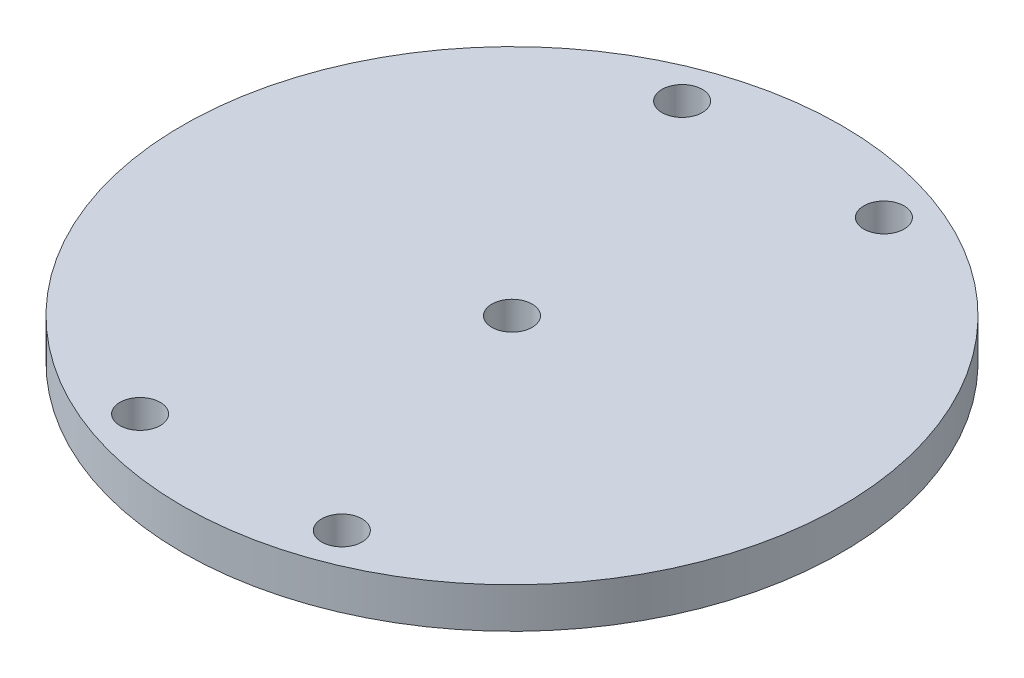
ISO-10303-21;
HEADER;
FILE_DESCRIPTION(('STEP AP214'),'2;1');
FILE_NAME('part.step','',(''),(''),'','','');
FILE_SCHEMA(('AUTOMOTIVE_DESIGN { 1 0 10303 214 1 1 1 1 }'));
ENDSEC;
DATA;
#1=APPLICATION_CONTEXT('core data for automotive mechanical design processes');
#2=APPLICATION_PROTOCOL_DEFINITION('international standard','automotive_design',2000,#1);
#3=PRODUCT_CONTEXT('',#1,'mechanical');
#4=PRODUCT('Part','Part','',(#3));
#5=PRODUCT_RELATED_PRODUCT_CATEGORY('part','',(#4));
#6=PRODUCT_DEFINITION_FORMATION('','',#4);
#7=PRODUCT_DEFINITION_CONTEXT('part definition',#1,'design');
#8=PRODUCT_DEFINITION('design','',#6,#7);
#9=PRODUCT_DEFINITION_SHAPE('','',#8);
#10=(LENGTH_UNIT() NAMED_UNIT(*) SI_UNIT(.MILLI.,.METRE.));
#11=(NAMED_UNIT(*) PLANE_ANGLE_UNIT() SI_UNIT($,.RADIAN.));
#12=(NAMED_UNIT(*) SI_UNIT($,.STERADIAN.) SOLID_ANGLE_UNIT());
#13=UNCERTAINTY_MEASURE_WITH_UNIT(LENGTH_MEASURE(1.E-05),#10,'distance_accuracy_value','');
#14=(GEOMETRIC_REPRESENTATION_CONTEXT(3) GLOBAL_UNCERTAINTY_ASSIGNED_CONTEXT((#13)) GLOBAL_UNIT_ASSIGNED_CONTEXT((#10,
#11,#12)) REPRESENTATION_CONTEXT('',''));
#15=CARTESIAN_POINT('',(0.,0.,0.));
#16=DIRECTION('',(0.,0.,1.));
#17=DIRECTION('',(1.,0.,0.));
#18=AXIS2_PLACEMENT_3D('',#15,#16,#17);
#19=CARTESIAN_POINT('',(0.,6.,0.));
#20=DIRECTION('',(0.,-1.,0.));
#21=DIRECTION('',(0.,0.,-1.));
#22=AXIS2_PLACEMENT_3D('',#19,#20,#21);
#23=CYLINDRICAL_SURFACE('',#22,49.);
#24=CARTESIAN_POINT('',(0.,6.,0.));
#25=DIRECTION('',(0.,1.,0.));
#26=DIRECTION('',(0.,0.,1.));
#27=AXIS2_PLACEMENT_3D('',#24,#25,#26);
#28=CIRCLE('',#27,49.);
#29=CARTESIAN_POINT('',(0.,6.,49.));
#30=VERTEX_POINT('',#29);
#31=EDGE_CURVE('E10',#30,#30,#28,.T.);
#32=ORIENTED_EDGE('',*,*,#31,.F.);
#33=EDGE_LOOP('',(#32));
#34=FACE_BOUND('',#33,.T.);
#35=CARTESIAN_POINT('',(0.,0.,0.));
#36=DIRECTION('',(0.,1.,0.));
#37=DIRECTION('',(0.,0.,1.));
#38=AXIS2_PLACEMENT_3D('',#35,#36,#37);
#39=CIRCLE('',#38,49.);
#40=CARTESIAN_POINT('',(0.,0.,49.));
#41=VERTEX_POINT('',#40);
#42=EDGE_CURVE('E37',#41,#41,#39,.T.);
#43=ORIENTED_EDGE('',*,*,#42,.T.);
#44=EDGE_LOOP('',(#43));
#45=FACE_BOUND('',#44,.T.);
#46=ADVANCED_FACE('F34',(#34,#45),#23,.T.);
#47=CARTESIAN_POINT('',(0.,6.,0.));
#48=DIRECTION('',(0.,1.,0.));
#49=DIRECTION('',(0.,0.,1.));
#50=AXIS2_PLACEMENT_3D('',#47,#48,#49);
#51=PLANE('',#50);
#52=CARTESIAN_POINT('',(-15.,6.,40.2988833592198));
#53=DIRECTION('',(0.,1.,0.));
#54=DIRECTION('',(0.,0.,1.));
#55=AXIS2_PLACEMENT_3D('',#52,#53,#54);
#56=CIRCLE('',#55,3.);
#57=CARTESIAN_POINT('',(-15.,6.,43.2988833592198));
#58=VERTEX_POINT('',#57);
#59=EDGE_CURVE('E70',#58,#58,#56,.T.);
#60=ORIENTED_EDGE('',*,*,#59,.F.);
#61=EDGE_LOOP('',(#60));
#62=FACE_BOUND('',#61,.T.);
#63=CARTESIAN_POINT('',(15.,6.,40.2988833592198));
#64=DIRECTION('',(0.,1.,0.));
#65=DIRECTION('',(0.,0.,1.));
#66=AXIS2_PLACEMENT_3D('',#63,#64,#65);
#67=CIRCLE('',#66,3.);
#68=CARTESIAN_POINT('',(15.,6.,43.2988833592198));
#69=VERTEX_POINT('',#68);
#70=EDGE_CURVE('E64',#69,#69,#67,.T.);
#71=ORIENTED_EDGE('',*,*,#70,.F.);
#72=EDGE_LOOP('',(#71));
#73=FACE_BOUND('',#72,.T.);
#74=CARTESIAN_POINT('',(0.,6.,0.));
#75=DIRECTION('',(0.,1.,0.));
#76=DIRECTION('',(0.,0.,1.));
#77=AXIS2_PLACEMENT_3D('',#74,#75,#76);
#78=CIRCLE('',#77,3.);
#79=CARTESIAN_POINT('',(0.,6.,3.));
#80=VERTEX_POINT('',#79);
#81=EDGE_CURVE('E58',#80,#80,#78,.T.);
#82=ORIENTED_EDGE('',*,*,#81,.F.);
#83=EDGE_LOOP('',(#82));
#84=FACE_BOUND('',#83,.T.);
#85=CARTESIAN_POINT('',(15.,6.,-40.2988833592198));
#86=DIRECTION('',(0.,1.,0.));
#87=DIRECTION('',(0.,0.,1.));
#88=AXIS2_PLACEMENT_3D('',#85,#86,#87);
#89=CIRCLE('',#88,3.);
#90=CARTESIAN_POINT('',(15.,6.,-37.2988833592198));
#91=VERTEX_POINT('',#90);
#92=EDGE_CURVE('E52',#91,#91,#89,.T.);
#93=ORIENTED_EDGE('',*,*,#92,.F.);
#94=EDGE_LOOP('',(#93));
#95=FACE_BOUND('',#94,.T.);
#96=CARTESIAN_POINT('',(-15.,6.,-40.2988833592198));
#97=DIRECTION('',(0.,1.,0.));
#98=DIRECTION('',(0.,0.,1.));
#99=AXIS2_PLACEMENT_3D('',#96,#97,#98);
#100=CIRCLE('',#99,3.);
#101=CARTESIAN_POINT('',(-15.,6.,-37.2988833592198));
#102=VERTEX_POINT('',#101);
#103=EDGE_CURVE('E46',#102,#102,#100,.T.);
#104=ORIENTED_EDGE('',*,*,#103,.F.);
#105=EDGE_LOOP('',(#104));
#106=FACE_BOUND('',#105,.T.);
#107=ORIENTED_EDGE('',*,*,#31,.T.);
#108=EDGE_LOOP('',(#107));
#109=FACE_BOUND('',#108,.T.);
#110=ADVANCED_FACE('F86',(#62,#73,#84,#95,#106,#109),#51,.T.);
#111=CARTESIAN_POINT('',(0.,0.,0.));
#112=DIRECTION('',(0.,1.,0.));
#113=DIRECTION('',(0.,0.,1.));
#114=AXIS2_PLACEMENT_3D('',#111,#112,#113);
#115=PLANE('',#114);
#116=CARTESIAN_POINT('',(-15.,0.,40.2988833592198));
#117=DIRECTION('',(0.,1.,0.));
#118=DIRECTION('',(0.,0.,1.));
#119=AXIS2_PLACEMENT_3D('',#116,#117,#118);
#120=CIRCLE('',#119,3.);
#121=CARTESIAN_POINT('',(-15.,0.,43.2988833592198));
#122=VERTEX_POINT('',#121);
#123=EDGE_CURVE('E67',#122,#122,#120,.T.);
#124=ORIENTED_EDGE('',*,*,#123,.T.);
#125=EDGE_LOOP('',(#124));
#126=FACE_BOUND('',#125,.T.);
#127=CARTESIAN_POINT('',(15.,0.,40.2988833592198));
#128=DIRECTION('',(0.,1.,0.));
#129=DIRECTION('',(0.,0.,1.));
#130=AXIS2_PLACEMENT_3D('',#127,#128,#129);
#131=CIRCLE('',#130,3.);
#132=CARTESIAN_POINT('',(15.,0.,43.2988833592198));
#133=VERTEX_POINT('',#132);
#134=EDGE_CURVE('E61',#133,#133,#131,.T.);
#135=ORIENTED_EDGE('',*,*,#134,.T.);
#136=EDGE_LOOP('',(#135));
#137=FACE_BOUND('',#136,.T.);
#138=CARTESIAN_POINT('',(0.,0.,0.));
#139=DIRECTION('',(0.,1.,0.));
#140=DIRECTION('',(0.,0.,1.));
#141=AXIS2_PLACEMENT_3D('',#138,#139,#140);
#142=CIRCLE('',#141,3.);
#143=CARTESIAN_POINT('',(0.,0.,3.));
#144=VERTEX_POINT('',#143);
#145=EDGE_CURVE('E55',#144,#144,#142,.T.);
#146=ORIENTED_EDGE('',*,*,#145,.T.);
#147=EDGE_LOOP('',(#146));
#148=FACE_BOUND('',#147,.T.);
#149=CARTESIAN_POINT('',(15.,0.,-40.2988833592198));
#150=DIRECTION('',(0.,1.,0.));
#151=DIRECTION('',(0.,0.,1.));
#152=AXIS2_PLACEMENT_3D('',#149,#150,#151);
#153=CIRCLE('',#152,3.);
#154=CARTESIAN_POINT('',(15.,0.,-37.2988833592198));
#155=VERTEX_POINT('',#154);
#156=EDGE_CURVE('E49',#155,#155,#153,.T.);
#157=ORIENTED_EDGE('',*,*,#156,.T.);
#158=EDGE_LOOP('',(#157));
#159=FACE_BOUND('',#158,.T.);
#160=CARTESIAN_POINT('',(-15.,0.,-40.2988833592198));
#161=DIRECTION('',(0.,1.,0.));
#162=DIRECTION('',(0.,0.,1.));
#163=AXIS2_PLACEMENT_3D('',#160,#161,#162);
#164=CIRCLE('',#163,3.);
#165=CARTESIAN_POINT('',(-15.,0.,-37.2988833592198));
#166=VERTEX_POINT('',#165);
#167=EDGE_CURVE('E44',#166,#166,#164,.T.);
#168=ORIENTED_EDGE('',*,*,#167,.T.);
#169=EDGE_LOOP('',(#168));
#170=FACE_BOUND('',#169,.T.);
#171=ORIENTED_EDGE('',*,*,#42,.F.);
#172=EDGE_LOOP('',(#171));
#173=FACE_BOUND('',#172,.T.);
#174=ADVANCED_FACE('F76',(#126,#137,#148,#159,#170,#173),#115,.F.);
#175=CARTESIAN_POINT('',(-15.,0.,-40.2988833592198));
#176=DIRECTION('',(0.,1.,0.));
#177=DIRECTION('',(0.,0.,1.));
#178=AXIS2_PLACEMENT_3D('',#175,#176,#177);
#179=CYLINDRICAL_SURFACE('',#178,3.);
#180=ORIENTED_EDGE('',*,*,#167,.F.);
#181=EDGE_LOOP('',(#180));
#182=FACE_BOUND('',#181,.T.);
#183=ORIENTED_EDGE('',*,*,#103,.T.);
#184=EDGE_LOOP('',(#183));
#185=FACE_BOUND('',#184,.T.);
#186=ADVANCED_FACE('F98',(#182,#185),#179,.F.);
#187=CARTESIAN_POINT('',(15.,0.,-40.2988833592198));
#188=DIRECTION('',(0.,1.,0.));
#189=DIRECTION('',(0.,0.,1.));
#190=AXIS2_PLACEMENT_3D('',#187,#188,#189);
#191=CYLINDRICAL_SURFACE('',#190,3.);
#192=ORIENTED_EDGE('',*,*,#156,.F.);
#193=EDGE_LOOP('',(#192));
#194=FACE_BOUND('',#193,.T.);
#195=ORIENTED_EDGE('',*,*,#92,.T.);
#196=EDGE_LOOP('',(#195));
#197=FACE_BOUND('',#196,.T.);
#198=ADVANCED_FACE('F100',(#194,#197),#191,.F.);
#199=CARTESIAN_POINT('',(0.,0.,0.));
#200=DIRECTION('',(0.,1.,0.));
#201=DIRECTION('',(0.,0.,1.));
#202=AXIS2_PLACEMENT_3D('',#199,#200,#201);
#203=CYLINDRICAL_SURFACE('',#202,3.);
#204=ORIENTED_EDGE('',*,*,#145,.F.);
#205=EDGE_LOOP('',(#204));
#206=FACE_BOUND('',#205,.T.);
#207=ORIENTED_EDGE('',*,*,#81,.T.);
#208=EDGE_LOOP('',(#207));
#209=FACE_BOUND('',#208,.T.);
#210=ADVANCED_FACE('F107',(#206,#209),#203,.F.);
#211=CARTESIAN_POINT('',(15.,0.,40.2988833592198));
#212=DIRECTION('',(0.,1.,0.));
#213=DIRECTION('',(0.,0.,1.));
#214=AXIS2_PLACEMENT_3D('',#211,#212,#213);
#215=CYLINDRICAL_SURFACE('',#214,3.);
#216=ORIENTED_EDGE('',*,*,#134,.F.);
#217=EDGE_LOOP('',(#216));
#218=FACE_BOUND('',#217,.T.);
#219=ORIENTED_EDGE('',*,*,#70,.T.);
#220=EDGE_LOOP('',(#219));
#221=FACE_BOUND('',#220,.T.);
#222=ADVANCED_FACE('F82',(#218,#221),#215,.F.);
#223=CARTESIAN_POINT('',(-15.,0.,40.2988833592198));
#224=DIRECTION('',(0.,1.,0.));
#225=DIRECTION('',(0.,0.,1.));
#226=AXIS2_PLACEMENT_3D('',#223,#224,#225);
#227=CYLINDRICAL_SURFACE('',#226,3.);
#228=ORIENTED_EDGE('',*,*,#123,.F.);
#229=EDGE_LOOP('',(#228));
#230=FACE_BOUND('',#229,.T.);
#231=ORIENTED_EDGE('',*,*,#59,.T.);
#232=EDGE_LOOP('',(#231));
#233=FACE_BOUND('',#232,.T.);
#234=ADVANCED_FACE('F79',(#230,#233),#227,.F.);
#235=CLOSED_SHELL('',(#46,#110,#174,#186,#198,#210,#222,#234));
#236=MANIFOLD_SOLID_BREP('B2',#235);
#237=ADVANCED_BREP_SHAPE_REPRESENTATION('',(#18,#236),#14);
#238=SHAPE_DEFINITION_REPRESENTATION(#9,#237);
ENDSEC;
END-ISO-10303-21;
